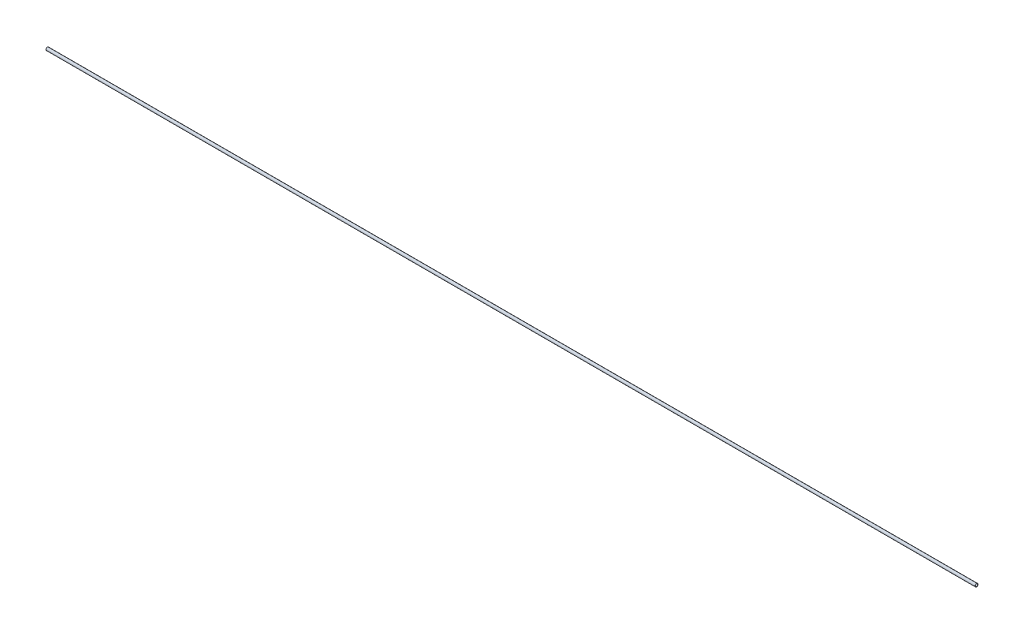
ISO-10303-21;
HEADER;
FILE_DESCRIPTION(('STEP AP214'),'2;1');
FILE_NAME('part.step','',(''),(''),'','','');
FILE_SCHEMA(('AUTOMOTIVE_DESIGN { 1 0 10303 214 1 1 1 1 }'));
ENDSEC;
DATA;
#1=APPLICATION_CONTEXT('core data for automotive mechanical design processes');
#2=APPLICATION_PROTOCOL_DEFINITION('international standard','automotive_design',2000,#1);
#3=PRODUCT_CONTEXT('',#1,'mechanical');
#4=PRODUCT('Part','Part','',(#3));
#5=PRODUCT_RELATED_PRODUCT_CATEGORY('part','',(#4));
#6=PRODUCT_DEFINITION_FORMATION('','',#4);
#7=PRODUCT_DEFINITION_CONTEXT('part definition',#1,'design');
#8=PRODUCT_DEFINITION('design','',#6,#7);
#9=PRODUCT_DEFINITION_SHAPE('','',#8);
#10=(LENGTH_UNIT() NAMED_UNIT(*) SI_UNIT(.MILLI.,.METRE.));
#11=(NAMED_UNIT(*) PLANE_ANGLE_UNIT() SI_UNIT($,.RADIAN.));
#12=(NAMED_UNIT(*) SI_UNIT($,.STERADIAN.) SOLID_ANGLE_UNIT());
#13=UNCERTAINTY_MEASURE_WITH_UNIT(LENGTH_MEASURE(1.E-05),#10,'distance_accuracy_value','');
#14=(GEOMETRIC_REPRESENTATION_CONTEXT(3) GLOBAL_UNCERTAINTY_ASSIGNED_CONTEXT((#13)) GLOBAL_UNIT_ASSIGNED_CONTEXT((#10,
#11,#12)) REPRESENTATION_CONTEXT('',''));
#15=CARTESIAN_POINT('',(0.,0.,0.));
#16=DIRECTION('',(0.,0.,1.));
#17=DIRECTION('',(1.,0.,0.));
#18=AXIS2_PLACEMENT_3D('',#15,#16,#17);
#19=CARTESIAN_POINT('',(1219.2,0.,0.));
#20=DIRECTION('',(-1.,0.,0.));
#21=DIRECTION('',(0.,0.,1.));
#22=AXIS2_PLACEMENT_3D('',#19,#20,#21);
#23=CYLINDRICAL_SURFACE('',#22,1.905);
#24=CARTESIAN_POINT('',(1219.2,0.,0.));
#25=DIRECTION('',(1.,0.,0.));
#26=DIRECTION('',(0.,0.,-1.));
#27=AXIS2_PLACEMENT_3D('',#24,#25,#26);
#28=CIRCLE('',#27,1.905);
#29=CARTESIAN_POINT('',(1219.2,0.,1.905));
#30=VERTEX_POINT('',#29);
#31=EDGE_CURVE('E10',#30,#30,#28,.T.);
#32=CARTESIAN_POINT('',(0.,0.,0.));
#33=DIRECTION('',(1.,0.,0.));
#34=DIRECTION('',(0.,0.,-1.));
#35=AXIS2_PLACEMENT_3D('',#32,#33,#34);
#36=CIRCLE('',#35,1.905);
#37=CARTESIAN_POINT('',(0.,0.,1.905));
#38=VERTEX_POINT('',#37);
#39=EDGE_CURVE('E35',#38,#38,#36,.T.);
#40=CARTESIAN_POINT('',(1219.2,0.,1.905));
#41=CARTESIAN_POINT('',(1206.5,0.,1.905));
#42=CARTESIAN_POINT('',(1193.8,0.,1.905));
#43=CARTESIAN_POINT('',(1168.4,0.,1.905));
#44=CARTESIAN_POINT('',(1155.7,0.,1.905));
#45=CARTESIAN_POINT('',(1130.3,0.,1.905));
#46=CARTESIAN_POINT('',(1117.6,0.,1.905));
#47=CARTESIAN_POINT('',(1092.2,0.,1.905));
#48=CARTESIAN_POINT('',(1079.5,0.,1.905));
#49=CARTESIAN_POINT('',(1054.1,0.,1.905));
#50=CARTESIAN_POINT('',(1041.4,0.,1.905));
#51=CARTESIAN_POINT('',(1016.,0.,1.905));
#52=CARTESIAN_POINT('',(1003.3,0.,1.905));
#53=CARTESIAN_POINT('',(977.9,0.,1.905));
#54=CARTESIAN_POINT('',(965.2,0.,1.905));
#55=CARTESIAN_POINT('',(939.8,0.,1.905));
#56=CARTESIAN_POINT('',(927.1,0.,1.905));
#57=CARTESIAN_POINT('',(901.7,0.,1.905));
#58=CARTESIAN_POINT('',(889.,0.,1.905));
#59=CARTESIAN_POINT('',(863.6,0.,1.905));
#60=CARTESIAN_POINT('',(850.9,0.,1.905));
#61=CARTESIAN_POINT('',(825.5,0.,1.905));
#62=CARTESIAN_POINT('',(812.8,0.,1.905));
#63=CARTESIAN_POINT('',(787.4,0.,1.905));
#64=CARTESIAN_POINT('',(774.7,0.,1.905));
#65=CARTESIAN_POINT('',(749.3,0.,1.905));
#66=CARTESIAN_POINT('',(736.6,0.,1.905));
#67=CARTESIAN_POINT('',(711.2,0.,1.905));
#68=CARTESIAN_POINT('',(698.5,0.,1.905));
#69=CARTESIAN_POINT('',(673.1,0.,1.905));
#70=CARTESIAN_POINT('',(660.4,0.,1.905));
#71=CARTESIAN_POINT('',(635.,0.,1.905));
#72=CARTESIAN_POINT('',(622.3,0.,1.905));
#73=CARTESIAN_POINT('',(596.9,0.,1.905));
#74=CARTESIAN_POINT('',(584.2,0.,1.905));
#75=CARTESIAN_POINT('',(558.8,0.,1.905));
#76=CARTESIAN_POINT('',(546.1,0.,1.905));
#77=CARTESIAN_POINT('',(520.7,0.,1.905));
#78=CARTESIAN_POINT('',(508.,0.,1.905));
#79=CARTESIAN_POINT('',(482.6,0.,1.905));
#80=CARTESIAN_POINT('',(469.9,0.,1.905));
#81=CARTESIAN_POINT('',(444.5,0.,1.905));
#82=CARTESIAN_POINT('',(431.8,0.,1.905));
#83=CARTESIAN_POINT('',(406.4,0.,1.905));
#84=CARTESIAN_POINT('',(393.7,0.,1.905));
#85=CARTESIAN_POINT('',(368.3,0.,1.905));
#86=CARTESIAN_POINT('',(355.6,0.,1.905));
#87=CARTESIAN_POINT('',(330.2,0.,1.905));
#88=CARTESIAN_POINT('',(317.5,0.,1.905));
#89=CARTESIAN_POINT('',(292.1,0.,1.905));
#90=CARTESIAN_POINT('',(279.4,0.,1.905));
#91=CARTESIAN_POINT('',(254.,0.,1.905));
#92=CARTESIAN_POINT('',(241.3,0.,1.905));
#93=CARTESIAN_POINT('',(215.9,0.,1.905));
#94=CARTESIAN_POINT('',(203.2,0.,1.905));
#95=CARTESIAN_POINT('',(177.8,0.,1.905));
#96=CARTESIAN_POINT('',(165.1,0.,1.905));
#97=CARTESIAN_POINT('',(139.7,0.,1.905));
#98=CARTESIAN_POINT('',(127.,0.,1.905));
#99=CARTESIAN_POINT('',(101.6,0.,1.905));
#100=CARTESIAN_POINT('',(88.9,0.,1.905));
#101=CARTESIAN_POINT('',(63.5,0.,1.905));
#102=CARTESIAN_POINT('',(50.8,0.,1.905));
#103=CARTESIAN_POINT('',(25.4,0.,1.905));
#104=CARTESIAN_POINT('',(12.7,0.,1.905));
#105=CARTESIAN_POINT('',(0.,0.,1.905));
#106=B_SPLINE_CURVE_WITH_KNOTS('',3,(#40,#41,#42,#43,#44,#45,#46,#47,#48,#49,#50,#51,#52,#53,
#54,#55,#56,#57,#58,#59,#60,#61,#62,#63,#64,#65,#66,#67,#68,#69,#70,#71,#72,#73,#74,#75,#76,#77,
#78,#79,#80,#81,#82,#83,#84,#85,#86,#87,#88,#89,#90,#91,#92,#93,#94,#95,#96,#97,#98,#99,#100,
#101,#102,#103,#104,#105),.UNSPECIFIED.,.F.,.F.,(4,2,2,2,2,2,2,2,2,2,2,2,2,2,2,2,2,2,2,2,2,2,2,
2,2,2,2,2,2,2,2,2,4),(0.,38.0999999999998,76.1999999999998,114.3,152.4,190.5,228.6,266.7,304.8,
342.9,381.,419.1,457.2,495.3,533.4,571.5,609.6,647.7,685.8,723.9,762.,800.1,838.2,876.3,914.4,
952.5,990.6,1028.7,1066.8,1104.9,1143.,1181.1,1219.2),.UNSPECIFIED.);
#107=EDGE_CURVE('BSEAM32',#30,#38,#106,.T.);
#108=ORIENTED_EDGE('',*,*,#31,.F.);
#109=ORIENTED_EDGE('',*,*,#39,.T.);
#110=ORIENTED_EDGE('',*,*,#107,.T.);
#111=ORIENTED_EDGE('',*,*,#107,.F.);
#112=EDGE_LOOP('',(#108,#110,#109,#111));
#113=FACE_BOUND('',#112,.T.);
#114=ADVANCED_FACE('F32',(#113),#23,.T.);
#115=CARTESIAN_POINT('',(1219.2,0.,0.));
#116=DIRECTION('',(1.,0.,0.));
#117=DIRECTION('',(0.,0.,-1.));
#118=AXIS2_PLACEMENT_3D('',#115,#116,#117);
#119=PLANE('',#118);
#120=CARTESIAN_POINT('',(1219.2,0.,0.));
#121=DIRECTION('',(-1.,0.,0.));
#122=DIRECTION('',(0.,0.,1.));
#123=AXIS2_PLACEMENT_3D('',#120,#121,#122);
#124=CIRCLE('',#123,1.5875);
#125=CARTESIAN_POINT('',(1219.2,0.,1.5875));
#126=VERTEX_POINT('',#125);
#127=EDGE_CURVE('E42',#126,#126,#124,.T.);
#128=ORIENTED_EDGE('',*,*,#127,.T.);
#129=EDGE_LOOP('',(#128));
#130=FACE_BOUND('',#129,.T.);
#131=ORIENTED_EDGE('',*,*,#31,.T.);
#132=EDGE_LOOP('',(#131));
#133=FACE_BOUND('',#132,.T.);
#134=ADVANCED_FACE('F50',(#130,#133),#119,.T.);
#135=CARTESIAN_POINT('',(0.,0.,0.));
#136=DIRECTION('',(1.,0.,0.));
#137=DIRECTION('',(0.,0.,-1.));
#138=AXIS2_PLACEMENT_3D('',#135,#136,#137);
#139=PLANE('',#138);
#140=CARTESIAN_POINT('',(0.,0.,0.));
#141=DIRECTION('',(-1.,0.,0.));
#142=DIRECTION('',(0.,0.,1.));
#143=AXIS2_PLACEMENT_3D('',#140,#141,#142);
#144=CIRCLE('',#143,1.5875);
#145=CARTESIAN_POINT('',(0.,0.,1.5875));
#146=VERTEX_POINT('',#145);
#147=EDGE_CURVE('E44',#146,#146,#144,.T.);
#148=ORIENTED_EDGE('',*,*,#147,.F.);
#149=EDGE_LOOP('',(#148));
#150=FACE_BOUND('',#149,.T.);
#151=ORIENTED_EDGE('',*,*,#39,.F.);
#152=EDGE_LOOP('',(#151));
#153=FACE_BOUND('',#152,.T.);
#154=ADVANCED_FACE('F55',(#150,#153),#139,.F.);
#155=CARTESIAN_POINT('',(1219.2,0.,0.));
#156=DIRECTION('',(-1.,0.,0.));
#157=DIRECTION('',(0.,0.,1.));
#158=AXIS2_PLACEMENT_3D('',#155,#156,#157);
#159=CYLINDRICAL_SURFACE('',#158,1.5875);
#160=CARTESIAN_POINT('',(1219.2,0.,1.5875));
#161=CARTESIAN_POINT('',(1206.5,0.,1.5875));
#162=CARTESIAN_POINT('',(1193.8,0.,1.5875));
#163=CARTESIAN_POINT('',(1168.4,0.,1.5875));
#164=CARTESIAN_POINT('',(1155.7,0.,1.5875));
#165=CARTESIAN_POINT('',(1130.3,0.,1.5875));
#166=CARTESIAN_POINT('',(1117.6,0.,1.5875));
#167=CARTESIAN_POINT('',(1092.2,0.,1.5875));
#168=CARTESIAN_POINT('',(1079.5,0.,1.5875));
#169=CARTESIAN_POINT('',(1054.1,0.,1.5875));
#170=CARTESIAN_POINT('',(1041.4,0.,1.5875));
#171=CARTESIAN_POINT('',(1016.,0.,1.5875));
#172=CARTESIAN_POINT('',(1003.3,0.,1.5875));
#173=CARTESIAN_POINT('',(977.9,0.,1.5875));
#174=CARTESIAN_POINT('',(965.2,0.,1.5875));
#175=CARTESIAN_POINT('',(939.8,0.,1.5875));
#176=CARTESIAN_POINT('',(927.1,0.,1.5875));
#177=CARTESIAN_POINT('',(901.7,0.,1.5875));
#178=CARTESIAN_POINT('',(889.,0.,1.5875));
#179=CARTESIAN_POINT('',(863.6,0.,1.5875));
#180=CARTESIAN_POINT('',(850.9,0.,1.5875));
#181=CARTESIAN_POINT('',(825.5,0.,1.5875));
#182=CARTESIAN_POINT('',(812.8,0.,1.5875));
#183=CARTESIAN_POINT('',(787.4,0.,1.5875));
#184=CARTESIAN_POINT('',(774.7,0.,1.5875));
#185=CARTESIAN_POINT('',(749.3,0.,1.5875));
#186=CARTESIAN_POINT('',(736.6,0.,1.5875));
#187=CARTESIAN_POINT('',(711.2,0.,1.5875));
#188=CARTESIAN_POINT('',(698.5,0.,1.5875));
#189=CARTESIAN_POINT('',(673.1,0.,1.5875));
#190=CARTESIAN_POINT('',(660.4,0.,1.5875));
#191=CARTESIAN_POINT('',(635.,0.,1.5875));
#192=CARTESIAN_POINT('',(622.3,0.,1.5875));
#193=CARTESIAN_POINT('',(596.9,0.,1.5875));
#194=CARTESIAN_POINT('',(584.2,0.,1.5875));
#195=CARTESIAN_POINT('',(558.8,0.,1.5875));
#196=CARTESIAN_POINT('',(546.1,0.,1.5875));
#197=CARTESIAN_POINT('',(520.7,0.,1.5875));
#198=CARTESIAN_POINT('',(508.,0.,1.5875));
#199=CARTESIAN_POINT('',(482.6,0.,1.5875));
#200=CARTESIAN_POINT('',(469.9,0.,1.5875));
#201=CARTESIAN_POINT('',(444.5,0.,1.5875));
#202=CARTESIAN_POINT('',(431.8,0.,1.5875));
#203=CARTESIAN_POINT('',(406.4,0.,1.5875));
#204=CARTESIAN_POINT('',(393.7,0.,1.5875));
#205=CARTESIAN_POINT('',(368.3,0.,1.5875));
#206=CARTESIAN_POINT('',(355.6,0.,1.5875));
#207=CARTESIAN_POINT('',(330.2,0.,1.5875));
#208=CARTESIAN_POINT('',(317.5,0.,1.5875));
#209=CARTESIAN_POINT('',(292.1,0.,1.5875));
#210=CARTESIAN_POINT('',(279.4,0.,1.5875));
#211=CARTESIAN_POINT('',(254.,0.,1.5875));
#212=CARTESIAN_POINT('',(241.3,0.,1.5875));
#213=CARTESIAN_POINT('',(215.9,0.,1.5875));
#214=CARTESIAN_POINT('',(203.2,0.,1.5875));
#215=CARTESIAN_POINT('',(177.8,0.,1.5875));
#216=CARTESIAN_POINT('',(165.1,0.,1.5875));
#217=CARTESIAN_POINT('',(139.7,0.,1.5875));
#218=CARTESIAN_POINT('',(127.,0.,1.5875));
#219=CARTESIAN_POINT('',(101.6,0.,1.5875));
#220=CARTESIAN_POINT('',(88.9,0.,1.5875));
#221=CARTESIAN_POINT('',(63.5,0.,1.5875));
#222=CARTESIAN_POINT('',(50.8,0.,1.5875));
#223=CARTESIAN_POINT('',(25.4,0.,1.5875));
#224=CARTESIAN_POINT('',(12.7,0.,1.5875));
#225=CARTESIAN_POINT('',(0.,0.,1.5875));
#226=B_SPLINE_CURVE_WITH_KNOTS('',3,(#160,#161,#162,#163,#164,#165,#166,#167,#168,#169,#170,
#171,#172,#173,#174,#175,#176,#177,#178,#179,#180,#181,#182,#183,#184,#185,#186,#187,#188,#189,
#190,#191,#192,#193,#194,#195,#196,#197,#198,#199,#200,#201,#202,#203,#204,#205,#206,#207,#208,
#209,#210,#211,#212,#213,#214,#215,#216,#217,#218,#219,#220,#221,#222,#223,#224,#225),
.UNSPECIFIED.,.F.,.F.,(4,2,2,2,2,2,2,2,2,2,2,2,2,2,2,2,2,2,2,2,2,2,2,2,2,2,2,2,2,2,2,2,4),(0.,
38.1,76.2,114.3,152.4,190.5,228.6,266.7,304.8,342.9,381.,419.1,457.2,495.3,533.4,571.5,609.6,
647.7,685.8,723.9,762.,800.1,838.2,876.3,914.4,952.5,990.6,1028.7,1066.8,1104.9,1143.,1181.1,
1219.2),.UNSPECIFIED.);
#227=EDGE_CURVE('BSEAM52',#126,#146,#226,.T.);
#228=ORIENTED_EDGE('',*,*,#127,.F.);
#229=ORIENTED_EDGE('',*,*,#147,.T.);
#230=ORIENTED_EDGE('',*,*,#227,.T.);
#231=ORIENTED_EDGE('',*,*,#227,.F.);
#232=EDGE_LOOP('',(#228,#230,#229,#231));
#233=FACE_BOUND('',#232,.T.);
#234=ADVANCED_FACE('F52',(#233),#159,.F.);
#235=CLOSED_SHELL('',(#114,#134,#154,#234));
#236=MANIFOLD_SOLID_BREP('B2',#235);
#237=ADVANCED_BREP_SHAPE_REPRESENTATION('',(#18,#236),#14);
#238=SHAPE_DEFINITION_REPRESENTATION(#9,#237);
ENDSEC;
END-ISO-10303-21;
